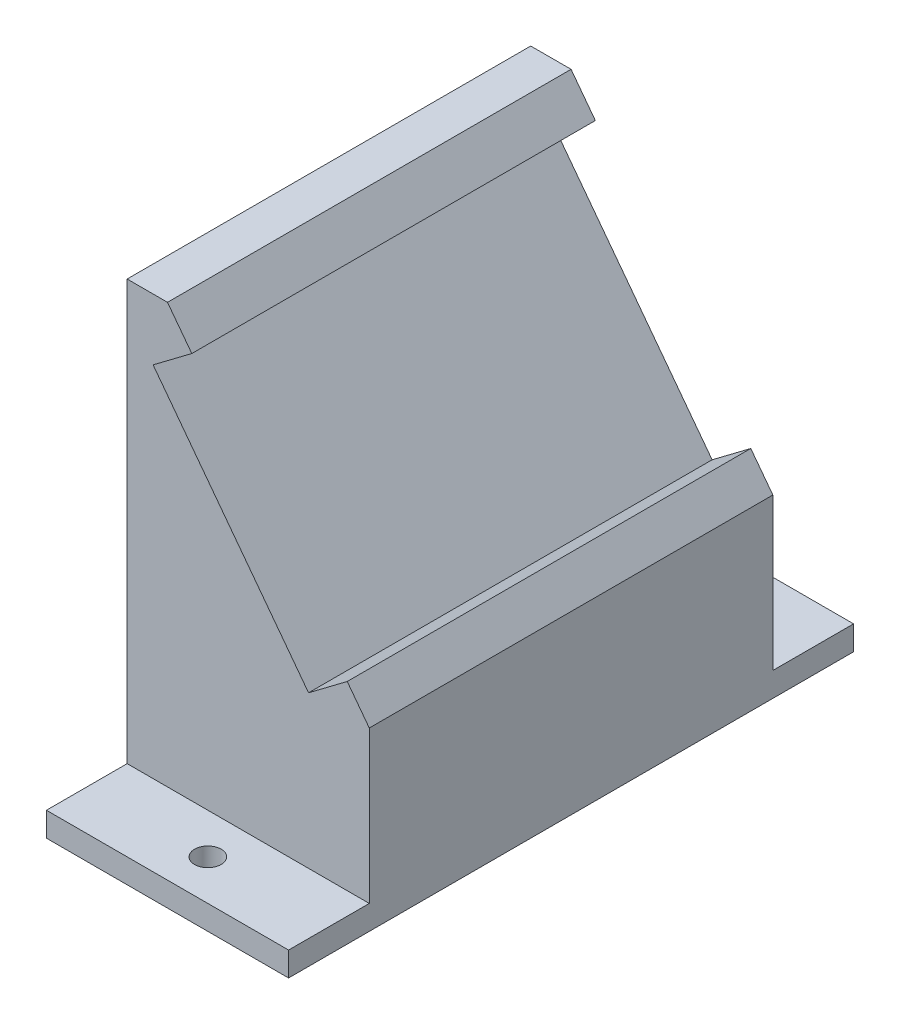
ISO-10303-21;
HEADER;
FILE_DESCRIPTION(('STEP AP214'),'2;1');
FILE_NAME('part.step','',(''),(''),'','','');
FILE_SCHEMA(('AUTOMOTIVE_DESIGN { 1 0 10303 214 1 1 1 1 }'));
ENDSEC;
DATA;
#1=APPLICATION_CONTEXT('core data for automotive mechanical design processes');
#2=APPLICATION_PROTOCOL_DEFINITION('international standard','automotive_design',2000,#1);
#3=PRODUCT_CONTEXT('',#1,'mechanical');
#4=PRODUCT('Part','Part','',(#3));
#5=PRODUCT_RELATED_PRODUCT_CATEGORY('part','',(#4));
#6=PRODUCT_DEFINITION_FORMATION('','',#4);
#7=PRODUCT_DEFINITION_CONTEXT('part definition',#1,'design');
#8=PRODUCT_DEFINITION('design','',#6,#7);
#9=PRODUCT_DEFINITION_SHAPE('','',#8);
#10=(LENGTH_UNIT() NAMED_UNIT(*) SI_UNIT(.MILLI.,.METRE.));
#11=(NAMED_UNIT(*) PLANE_ANGLE_UNIT() SI_UNIT($,.RADIAN.));
#12=(NAMED_UNIT(*) SI_UNIT($,.STERADIAN.) SOLID_ANGLE_UNIT());
#13=UNCERTAINTY_MEASURE_WITH_UNIT(LENGTH_MEASURE(1.E-05),#10,'distance_accuracy_value','');
#14=(GEOMETRIC_REPRESENTATION_CONTEXT(3) GLOBAL_UNCERTAINTY_ASSIGNED_CONTEXT((#13)) GLOBAL_UNIT_ASSIGNED_CONTEXT((#10,
#11,#12)) REPRESENTATION_CONTEXT('',''));
#15=CARTESIAN_POINT('',(0.,0.,0.));
#16=DIRECTION('',(0.,0.,1.));
#17=DIRECTION('',(1.,0.,0.));
#18=AXIS2_PLACEMENT_3D('',#15,#16,#17);
#19=CARTESIAN_POINT('',(-15.,0.,-25.));
#20=DIRECTION('',(0.,-1.,0.));
#21=DIRECTION('',(0.,0.,-1.));
#22=AXIS2_PLACEMENT_3D('',#19,#20,#21);
#23=PLANE('',#22);
#24=CARTESIAN_POINT('',(0.,0.,-30.));
#25=DIRECTION('',(0.,-1.,0.));
#26=DIRECTION('',(0.,0.,-1.));
#27=AXIS2_PLACEMENT_3D('',#24,#25,#26);
#28=CIRCLE('',#27,1.65);
#29=CARTESIAN_POINT('',(0.,0.,-31.65));
#30=VERTEX_POINT('',#29);
#31=EDGE_CURVE('E169',#30,#30,#28,.T.);
#32=ORIENTED_EDGE('',*,*,#31,.F.);
#33=EDGE_LOOP('',(#32));
#34=FACE_BOUND('',#33,.T.);
#35=CARTESIAN_POINT('',(0.,0.,30.));
#36=DIRECTION('',(0.,-1.,0.));
#37=DIRECTION('',(0.,0.,-1.));
#38=AXIS2_PLACEMENT_3D('',#35,#36,#37);
#39=CIRCLE('',#38,1.65);
#40=CARTESIAN_POINT('',(0.,0.,28.35));
#41=VERTEX_POINT('',#40);
#42=EDGE_CURVE('E175',#41,#41,#39,.F.);
#43=ORIENTED_EDGE('',*,*,#42,.T.);
#44=EDGE_LOOP('',(#43));
#45=FACE_BOUND('',#44,.T.);
#46=DIRECTION('',(0.,0.,1.));
#47=VECTOR('',#46,1.);
#48=CARTESIAN_POINT('',(15.,0.,-25.));
#49=LINE('',#48,#47);
#50=CARTESIAN_POINT('',(15.,0.,-35.));
#51=VERTEX_POINT('',#50);
#52=CARTESIAN_POINT('',(15.,0.,35.));
#53=VERTEX_POINT('',#52);
#54=EDGE_CURVE('E42',#51,#53,#49,.T.);
#55=ORIENTED_EDGE('',*,*,#54,.T.);
#56=DIRECTION('',(1.,0.,0.));
#57=VECTOR('',#56,1.);
#58=CARTESIAN_POINT('',(-15.,0.,35.));
#59=LINE('',#58,#57);
#60=CARTESIAN_POINT('',(-15.,0.,35.));
#61=VERTEX_POINT('',#60);
#62=EDGE_CURVE('E183',#61,#53,#59,.T.);
#63=ORIENTED_EDGE('',*,*,#62,.F.);
#64=DIRECTION('',(0.,0.,1.));
#65=VECTOR('',#64,1.);
#66=CARTESIAN_POINT('',(-15.,0.,-25.));
#67=LINE('',#66,#65);
#68=CARTESIAN_POINT('',(-15.,0.,-35.));
#69=VERTEX_POINT('',#68);
#70=EDGE_CURVE('E11',#69,#61,#67,.T.);
#71=ORIENTED_EDGE('',*,*,#70,.F.);
#72=DIRECTION('',(1.,0.,0.));
#73=VECTOR('',#72,1.);
#74=CARTESIAN_POINT('',(-15.,0.,-35.));
#75=LINE('',#74,#73);
#76=EDGE_CURVE('E153',#69,#51,#75,.T.);
#77=ORIENTED_EDGE('',*,*,#76,.T.);
#78=EDGE_LOOP('',(#55,#63,#71,#77));
#79=FACE_BOUND('',#78,.T.);
#80=ADVANCED_FACE('F39',(#34,#45,#79),#23,.T.);
#81=CARTESIAN_POINT('',(-15.,0.,-25.));
#82=DIRECTION('',(1.,0.,0.));
#83=DIRECTION('',(0.,0.,-1.));
#84=AXIS2_PLACEMENT_3D('',#81,#82,#83);
#85=PLANE('',#84);
#86=ORIENTED_EDGE('',*,*,#70,.T.);
#87=DIRECTION('',(0.,-1.,0.));
#88=VECTOR('',#87,1.);
#89=CARTESIAN_POINT('',(-15.,0.,35.));
#90=LINE('',#89,#88);
#91=CARTESIAN_POINT('',(-15.,3.,35.));
#92=VERTEX_POINT('',#91);
#93=EDGE_CURVE('E179',#92,#61,#90,.T.);
#94=ORIENTED_EDGE('',*,*,#93,.F.);
#95=DIRECTION('',(0.,0.,-1.));
#96=VECTOR('',#95,1.);
#97=CARTESIAN_POINT('',(-15.,3.,35.));
#98=LINE('',#97,#96);
#99=CARTESIAN_POINT('',(-15.,3.,25.));
#100=VERTEX_POINT('',#99);
#101=EDGE_CURVE('E193',#92,#100,#98,.T.);
#102=ORIENTED_EDGE('',*,*,#101,.T.);
#103=DIRECTION('',(0.,1.,0.));
#104=VECTOR('',#103,1.);
#105=CARTESIAN_POINT('',(-15.,0.,25.));
#106=LINE('',#105,#104);
#107=CARTESIAN_POINT('',(-15.,55.,25.));
#108=VERTEX_POINT('',#107);
#109=EDGE_CURVE('E230',#100,#108,#106,.T.);
#110=ORIENTED_EDGE('',*,*,#109,.T.);
#111=DIRECTION('',(0.,0.,1.));
#112=VECTOR('',#111,1.);
#113=CARTESIAN_POINT('',(-15.,55.,-25.));
#114=LINE('',#113,#112);
#115=CARTESIAN_POINT('',(-15.,55.,-25.));
#116=VERTEX_POINT('',#115);
#117=EDGE_CURVE('E48',#116,#108,#114,.T.);
#118=ORIENTED_EDGE('',*,*,#117,.F.);
#119=DIRECTION('',(0.,1.,0.));
#120=VECTOR('',#119,1.);
#121=CARTESIAN_POINT('',(-15.,0.,-25.));
#122=LINE('',#121,#120);
#123=CARTESIAN_POINT('',(-15.,3.,-25.));
#124=VERTEX_POINT('',#123);
#125=EDGE_CURVE('E141',#124,#116,#122,.T.);
#126=ORIENTED_EDGE('',*,*,#125,.F.);
#127=DIRECTION('',(0.,0.,1.));
#128=VECTOR('',#127,1.);
#129=CARTESIAN_POINT('',(-15.,3.,-35.));
#130=LINE('',#129,#128);
#131=CARTESIAN_POINT('',(-15.,3.,-35.));
#132=VERTEX_POINT('',#131);
#133=EDGE_CURVE('E56',#132,#124,#130,.T.);
#134=ORIENTED_EDGE('',*,*,#133,.F.);
#135=DIRECTION('',(0.,-1.,0.));
#136=VECTOR('',#135,1.);
#137=CARTESIAN_POINT('',(-15.,0.,-35.));
#138=LINE('',#137,#136);
#139=EDGE_CURVE('E138',#132,#69,#138,.T.);
#140=ORIENTED_EDGE('',*,*,#139,.T.);
#141=EDGE_LOOP('',(#86,#94,#102,#110,#118,#126,#134,#140));
#142=FACE_BOUND('',#141,.T.);
#143=ADVANCED_FACE('F137',(#142),#85,.F.);
#144=CARTESIAN_POINT('',(-10.,55.,-25.));
#145=DIRECTION('',(0.,1.,0.));
#146=DIRECTION('',(0.,0.,1.));
#147=AXIS2_PLACEMENT_3D('',#144,#145,#146);
#148=PLANE('',#147);
#149=ORIENTED_EDGE('',*,*,#117,.T.);
#150=DIRECTION('',(-1.,0.,0.));
#151=VECTOR('',#150,1.);
#152=CARTESIAN_POINT('',(-10.,55.,25.));
#153=LINE('',#152,#151);
#154=CARTESIAN_POINT('',(-10.,55.,25.));
#155=VERTEX_POINT('',#154);
#156=EDGE_CURVE('E226',#155,#108,#153,.T.);
#157=ORIENTED_EDGE('',*,*,#156,.F.);
#158=DIRECTION('',(0.,0.,1.));
#159=VECTOR('',#158,1.);
#160=CARTESIAN_POINT('',(-10.,55.,-25.));
#161=LINE('',#160,#159);
#162=CARTESIAN_POINT('',(-10.,55.,-25.));
#163=VERTEX_POINT('',#162);
#164=EDGE_CURVE('E261',#163,#155,#161,.T.);
#165=ORIENTED_EDGE('',*,*,#164,.F.);
#166=DIRECTION('',(-1.,0.,0.));
#167=VECTOR('',#166,1.);
#168=CARTESIAN_POINT('',(-10.,55.,-25.));
#169=LINE('',#168,#167);
#170=EDGE_CURVE('E252',#163,#116,#169,.T.);
#171=ORIENTED_EDGE('',*,*,#170,.T.);
#172=EDGE_LOOP('',(#149,#157,#165,#171));
#173=FACE_BOUND('',#172,.T.);
#174=ADVANCED_FACE('F295',(#173),#148,.T.);
#175=CARTESIAN_POINT('',(-10.,55.,-25.));
#176=DIRECTION('',(-0.798635510047289,-0.601815023152053,0.));
#177=DIRECTION('',(0.601815023152053,-0.798635510047289,0.));
#178=AXIS2_PLACEMENT_3D('',#175,#176,#177);
#179=PLANE('',#178);
#180=ORIENTED_EDGE('',*,*,#164,.T.);
#181=DIRECTION('',(0.601815023152053,-0.798635510047289,0.));
#182=VECTOR('',#181,1.);
#183=CARTESIAN_POINT('',(-10.,55.,25.));
#184=LINE('',#183,#182);
#185=CARTESIAN_POINT('',(-6.99092488423973,51.0068224497636,25.));
#186=VERTEX_POINT('',#185);
#187=EDGE_CURVE('E222',#155,#186,#184,.T.);
#188=ORIENTED_EDGE('',*,*,#187,.T.);
#189=DIRECTION('',(0.,0.,1.));
#190=VECTOR('',#189,1.);
#191=CARTESIAN_POINT('',(-6.99092488423973,51.0068224497636,-25.));
#192=LINE('',#191,#190);
#193=CARTESIAN_POINT('',(-6.99092488423973,51.0068224497636,-25.));
#194=VERTEX_POINT('',#193);
#195=EDGE_CURVE('E264',#194,#186,#192,.T.);
#196=ORIENTED_EDGE('',*,*,#195,.F.);
#197=DIRECTION('',(0.601815023152053,-0.798635510047289,0.));
#198=VECTOR('',#197,1.);
#199=CARTESIAN_POINT('',(-10.,55.,-25.));
#200=LINE('',#199,#198);
#201=EDGE_CURVE('E249',#163,#194,#200,.T.);
#202=ORIENTED_EDGE('',*,*,#201,.F.);
#203=EDGE_LOOP('',(#180,#188,#196,#202));
#204=FACE_BOUND('',#203,.T.);
#205=ADVANCED_FACE('F303',(#204),#179,.F.);
#206=CARTESIAN_POINT('',(-6.99092488423973,51.0068224497636,-25.));
#207=DIRECTION('',(-0.601815023152052,0.79863551004729,0.));
#208=DIRECTION('',(-0.79863551004729,-0.601815023152052,0.));
#209=AXIS2_PLACEMENT_3D('',#206,#207,#208);
#210=PLANE('',#209);
#211=ORIENTED_EDGE('',*,*,#195,.T.);
#212=DIRECTION('',(-0.79863551004729,-0.601815023152052,0.));
#213=VECTOR('',#212,1.);
#214=CARTESIAN_POINT('',(-6.99092488423973,51.0068224497636,25.));
#215=LINE('',#214,#213);
#216=CARTESIAN_POINT('',(-11.7827379445235,47.3959323108512,25.));
#217=VERTEX_POINT('',#216);
#218=EDGE_CURVE('E218',#186,#217,#215,.T.);
#219=ORIENTED_EDGE('',*,*,#218,.T.);
#220=DIRECTION('',(0.,0.,1.));
#221=VECTOR('',#220,1.);
#222=CARTESIAN_POINT('',(-11.7827379445235,47.3959323108512,-25.));
#223=LINE('',#222,#221);
#224=CARTESIAN_POINT('',(-11.7827379445235,47.3959323108512,-25.));
#225=VERTEX_POINT('',#224);
#226=EDGE_CURVE('E267',#225,#217,#223,.T.);
#227=ORIENTED_EDGE('',*,*,#226,.F.);
#228=DIRECTION('',(-0.79863551004729,-0.601815023152052,0.));
#229=VECTOR('',#228,1.);
#230=CARTESIAN_POINT('',(-6.99092488423973,51.0068224497636,-25.));
#231=LINE('',#230,#229);
#232=EDGE_CURVE('E246',#194,#225,#231,.T.);
#233=ORIENTED_EDGE('',*,*,#232,.F.);
#234=EDGE_LOOP('',(#211,#219,#227,#233));
#235=FACE_BOUND('',#234,.T.);
#236=ADVANCED_FACE('F324',(#235),#210,.F.);
#237=CARTESIAN_POINT('',(-11.7827379445235,47.3959323108512,-25.));
#238=DIRECTION('',(-0.798635510047289,-0.601815023152053,0.));
#239=DIRECTION('',(0.601815023152053,-0.798635510047289,0.));
#240=AXIS2_PLACEMENT_3D('',#237,#238,#239);
#241=PLANE('',#240);
#242=ORIENTED_EDGE('',*,*,#226,.T.);
#243=DIRECTION('',(0.601815023152053,-0.798635510047289,0.));
#244=VECTOR('',#243,1.);
#245=CARTESIAN_POINT('',(-11.7827379445235,47.3959323108512,25.));
#246=LINE('',#245,#244);
#247=CARTESIAN_POINT('',(7.47534279634223,21.839595989338,25.));
#248=VERTEX_POINT('',#247);
#249=EDGE_CURVE('E214',#217,#248,#246,.T.);
#250=ORIENTED_EDGE('',*,*,#249,.T.);
#251=DIRECTION('',(0.,0.,1.));
#252=VECTOR('',#251,1.);
#253=CARTESIAN_POINT('',(7.47534279634223,21.839595989338,-25.));
#254=LINE('',#253,#252);
#255=CARTESIAN_POINT('',(7.47534279634223,21.839595989338,-25.));
#256=VERTEX_POINT('',#255);
#257=EDGE_CURVE('E270',#256,#248,#254,.T.);
#258=ORIENTED_EDGE('',*,*,#257,.F.);
#259=DIRECTION('',(0.601815023152053,-0.798635510047289,0.));
#260=VECTOR('',#259,1.);
#261=CARTESIAN_POINT('',(-11.7827379445235,47.3959323108512,-25.));
#262=LINE('',#261,#260);
#263=EDGE_CURVE('E243',#225,#256,#262,.T.);
#264=ORIENTED_EDGE('',*,*,#263,.F.);
#265=EDGE_LOOP('',(#242,#250,#258,#264));
#266=FACE_BOUND('',#265,.T.);
#267=ADVANCED_FACE('F321',(#266),#241,.F.);
#268=CARTESIAN_POINT('',(7.47534279634223,21.839595989338,-25.));
#269=DIRECTION('',(0.601815023152062,-0.798635510047283,0.));
#270=DIRECTION('',(0.798635510047283,0.601815023152062,0.));
#271=AXIS2_PLACEMENT_3D('',#268,#269,#270);
#272=PLANE('',#271);
#273=ORIENTED_EDGE('',*,*,#257,.T.);
#274=DIRECTION('',(0.798635510047282,0.601815023152062,0.));
#275=VECTOR('',#274,1.);
#276=CARTESIAN_POINT('',(7.47534279634223,21.839595989338,25.));
#277=LINE('',#276,#275);
#278=CARTESIAN_POINT('',(12.2671558566259,25.4504861282503,25.));
#279=VERTEX_POINT('',#278);
#280=EDGE_CURVE('E210',#248,#279,#277,.T.);
#281=ORIENTED_EDGE('',*,*,#280,.T.);
#282=DIRECTION('',(0.,0.,1.));
#283=VECTOR('',#282,1.);
#284=CARTESIAN_POINT('',(12.2671558566259,25.4504861282503,-25.));
#285=LINE('',#284,#283);
#286=CARTESIAN_POINT('',(12.2671558566259,25.4504861282503,-25.));
#287=VERTEX_POINT('',#286);
#288=EDGE_CURVE('E273',#287,#279,#285,.T.);
#289=ORIENTED_EDGE('',*,*,#288,.F.);
#290=DIRECTION('',(0.798635510047282,0.601815023152062,0.));
#291=VECTOR('',#290,1.);
#292=CARTESIAN_POINT('',(7.47534279634223,21.839595989338,-25.));
#293=LINE('',#292,#291);
#294=EDGE_CURVE('E240',#256,#287,#293,.T.);
#295=ORIENTED_EDGE('',*,*,#294,.F.);
#296=EDGE_LOOP('',(#273,#281,#289,#295));
#297=FACE_BOUND('',#296,.T.);
#298=ADVANCED_FACE('F317',(#297),#272,.F.);
#299=CARTESIAN_POINT('',(12.2671558566259,25.4504861282503,-25.));
#300=DIRECTION('',(-0.798635510047289,-0.601815023152054,0.));
#301=DIRECTION('',(0.601815023152054,-0.798635510047289,0.));
#302=AXIS2_PLACEMENT_3D('',#299,#300,#301);
#303=PLANE('',#302);
#304=ORIENTED_EDGE('',*,*,#288,.T.);
#305=DIRECTION('',(0.601815023152054,-0.798635510047289,0.));
#306=VECTOR('',#305,1.);
#307=CARTESIAN_POINT('',(12.2671558566259,25.4504861282503,25.));
#308=LINE('',#307,#306);
#309=CARTESIAN_POINT('',(15.,21.8238794594901,25.));
#310=VERTEX_POINT('',#309);
#311=EDGE_CURVE('E206',#279,#310,#308,.T.);
#312=ORIENTED_EDGE('',*,*,#311,.T.);
#313=DIRECTION('',(0.,0.,1.));
#314=VECTOR('',#313,1.);
#315=CARTESIAN_POINT('',(15.,21.8238794594901,-25.));
#316=LINE('',#315,#314);
#317=CARTESIAN_POINT('',(15.,21.8238794594901,-25.));
#318=VERTEX_POINT('',#317);
#319=EDGE_CURVE('E275',#318,#310,#316,.T.);
#320=ORIENTED_EDGE('',*,*,#319,.F.);
#321=DIRECTION('',(0.601815023152054,-0.798635510047289,0.));
#322=VECTOR('',#321,1.);
#323=CARTESIAN_POINT('',(12.2671558566259,25.4504861282503,-25.));
#324=LINE('',#323,#322);
#325=EDGE_CURVE('E236',#287,#318,#324,.T.);
#326=ORIENTED_EDGE('',*,*,#325,.F.);
#327=EDGE_LOOP('',(#304,#312,#320,#326));
#328=FACE_BOUND('',#327,.T.);
#329=ADVANCED_FACE('F313',(#328),#303,.F.);
#330=CARTESIAN_POINT('',(15.,0.,-25.));
#331=DIRECTION('',(1.,0.,0.));
#332=DIRECTION('',(0.,0.,-1.));
#333=AXIS2_PLACEMENT_3D('',#330,#331,#332);
#334=PLANE('',#333);
#335=ORIENTED_EDGE('',*,*,#319,.T.);
#336=DIRECTION('',(0.,1.,0.));
#337=VECTOR('',#336,1.);
#338=CARTESIAN_POINT('',(15.,0.,25.));
#339=LINE('',#338,#337);
#340=CARTESIAN_POINT('',(15.,3.,25.));
#341=VERTEX_POINT('',#340);
#342=EDGE_CURVE('E203',#341,#310,#339,.T.);
#343=ORIENTED_EDGE('',*,*,#342,.F.);
#344=DIRECTION('',(0.,0.,-1.));
#345=VECTOR('',#344,1.);
#346=CARTESIAN_POINT('',(15.,3.,35.));
#347=LINE('',#346,#345);
#348=CARTESIAN_POINT('',(15.,3.,35.));
#349=VERTEX_POINT('',#348);
#350=EDGE_CURVE('E199',#349,#341,#347,.T.);
#351=ORIENTED_EDGE('',*,*,#350,.F.);
#352=DIRECTION('',(0.,1.,0.));
#353=VECTOR('',#352,1.);
#354=CARTESIAN_POINT('',(15.,0.,35.));
#355=LINE('',#354,#353);
#356=EDGE_CURVE('E187',#53,#349,#355,.T.);
#357=ORIENTED_EDGE('',*,*,#356,.F.);
#358=ORIENTED_EDGE('',*,*,#54,.F.);
#359=DIRECTION('',(0.,1.,0.));
#360=VECTOR('',#359,1.);
#361=CARTESIAN_POINT('',(15.,0.,-35.));
#362=LINE('',#361,#360);
#363=CARTESIAN_POINT('',(15.,3.,-35.));
#364=VERTEX_POINT('',#363);
#365=EDGE_CURVE('E159',#51,#364,#362,.T.);
#366=ORIENTED_EDGE('',*,*,#365,.T.);
#367=DIRECTION('',(0.,0.,1.));
#368=VECTOR('',#367,1.);
#369=CARTESIAN_POINT('',(15.,3.,-35.));
#370=LINE('',#369,#368);
#371=CARTESIAN_POINT('',(15.,3.,-25.));
#372=VERTEX_POINT('',#371);
#373=EDGE_CURVE('E144',#364,#372,#370,.T.);
#374=ORIENTED_EDGE('',*,*,#373,.T.);
#375=DIRECTION('',(0.,1.,0.));
#376=VECTOR('',#375,1.);
#377=CARTESIAN_POINT('',(15.,0.,-25.));
#378=LINE('',#377,#376);
#379=EDGE_CURVE('E233',#372,#318,#378,.T.);
#380=ORIENTED_EDGE('',*,*,#379,.T.);
#381=EDGE_LOOP('',(#335,#343,#351,#357,#358,#366,#374,#380));
#382=FACE_BOUND('',#381,.T.);
#383=ADVANCED_FACE('F288',(#382),#334,.T.);
#384=CARTESIAN_POINT('',(0.,0.,-25.));
#385=DIRECTION('',(0.,0.,1.));
#386=DIRECTION('',(1.,0.,0.));
#387=AXIS2_PLACEMENT_3D('',#384,#385,#386);
#388=PLANE('',#387);
#389=ORIENTED_EDGE('',*,*,#379,.F.);
#390=DIRECTION('',(-1.,0.,0.));
#391=VECTOR('',#390,1.);
#392=CARTESIAN_POINT('',(-15.,3.,-25.));
#393=LINE('',#392,#391);
#394=EDGE_CURVE('E155',#372,#124,#393,.T.);
#395=ORIENTED_EDGE('',*,*,#394,.T.);
#396=ORIENTED_EDGE('',*,*,#125,.T.);
#397=ORIENTED_EDGE('',*,*,#170,.F.);
#398=ORIENTED_EDGE('',*,*,#201,.T.);
#399=ORIENTED_EDGE('',*,*,#232,.T.);
#400=ORIENTED_EDGE('',*,*,#263,.T.);
#401=ORIENTED_EDGE('',*,*,#294,.T.);
#402=ORIENTED_EDGE('',*,*,#325,.T.);
#403=EDGE_LOOP('',(#389,#395,#396,#397,#398,#399,#400,#401,#402));
#404=FACE_BOUND('',#403,.T.);
#405=ADVANCED_FACE('F308',(#404),#388,.F.);
#406=CARTESIAN_POINT('',(0.,0.,25.));
#407=DIRECTION('',(0.,0.,1.));
#408=DIRECTION('',(1.,0.,0.));
#409=AXIS2_PLACEMENT_3D('',#406,#407,#408);
#410=PLANE('',#409);
#411=DIRECTION('',(-1.,0.,0.));
#412=VECTOR('',#411,1.);
#413=CARTESIAN_POINT('',(-15.,3.,25.));
#414=LINE('',#413,#412);
#415=EDGE_CURVE('E64',#341,#100,#414,.T.);
#416=ORIENTED_EDGE('',*,*,#415,.F.);
#417=ORIENTED_EDGE('',*,*,#342,.T.);
#418=ORIENTED_EDGE('',*,*,#311,.F.);
#419=ORIENTED_EDGE('',*,*,#280,.F.);
#420=ORIENTED_EDGE('',*,*,#249,.F.);
#421=ORIENTED_EDGE('',*,*,#218,.F.);
#422=ORIENTED_EDGE('',*,*,#187,.F.);
#423=ORIENTED_EDGE('',*,*,#156,.T.);
#424=ORIENTED_EDGE('',*,*,#109,.F.);
#425=EDGE_LOOP('',(#416,#417,#418,#419,#420,#421,#422,#423,#424));
#426=FACE_BOUND('',#425,.T.);
#427=ADVANCED_FACE('F298',(#426),#410,.T.);
#428=CARTESIAN_POINT('',(-15.,3.,35.));
#429=DIRECTION('',(0.,-1.,0.));
#430=DIRECTION('',(0.,0.,-1.));
#431=AXIS2_PLACEMENT_3D('',#428,#429,#430);
#432=PLANE('',#431);
#433=CARTESIAN_POINT('',(0.,3.,30.));
#434=DIRECTION('',(0.,1.,0.));
#435=DIRECTION('',(0.,0.,1.));
#436=AXIS2_PLACEMENT_3D('',#433,#434,#435);
#437=CIRCLE('',#436,1.65);
#438=CARTESIAN_POINT('',(0.,3.,31.65));
#439=VERTEX_POINT('',#438);
#440=EDGE_CURVE('E143',#439,#439,#437,.T.);
#441=ORIENTED_EDGE('',*,*,#440,.F.);
#442=EDGE_LOOP('',(#441));
#443=FACE_BOUND('',#442,.T.);
#444=ORIENTED_EDGE('',*,*,#415,.T.);
#445=ORIENTED_EDGE('',*,*,#101,.F.);
#446=DIRECTION('',(-1.,0.,0.));
#447=VECTOR('',#446,1.);
#448=CARTESIAN_POINT('',(-15.,3.,35.));
#449=LINE('',#448,#447);
#450=EDGE_CURVE('E190',#349,#92,#449,.T.);
#451=ORIENTED_EDGE('',*,*,#450,.F.);
#452=ORIENTED_EDGE('',*,*,#350,.T.);
#453=EDGE_LOOP('',(#444,#445,#451,#452));
#454=FACE_BOUND('',#453,.T.);
#455=ADVANCED_FACE('F292',(#443,#454),#432,.F.);
#456=CARTESIAN_POINT('',(0.,0.,35.));
#457=DIRECTION('',(0.,0.,-1.));
#458=DIRECTION('',(-1.,0.,0.));
#459=AXIS2_PLACEMENT_3D('',#456,#457,#458);
#460=PLANE('',#459);
#461=ORIENTED_EDGE('',*,*,#93,.T.);
#462=ORIENTED_EDGE('',*,*,#62,.T.);
#463=ORIENTED_EDGE('',*,*,#356,.T.);
#464=ORIENTED_EDGE('',*,*,#450,.T.);
#465=EDGE_LOOP('',(#461,#462,#463,#464));
#466=FACE_BOUND('',#465,.T.);
#467=ADVANCED_FACE('F285',(#466),#460,.F.);
#468=CARTESIAN_POINT('',(0.,-4.66690475583121,30.));
#469=DIRECTION('',(0.,1.,0.));
#470=DIRECTION('',(0.,0.,1.));
#471=AXIS2_PLACEMENT_3D('',#468,#469,#470);
#472=CYLINDRICAL_SURFACE('',#471,1.65);
#473=ORIENTED_EDGE('',*,*,#440,.T.);
#474=EDGE_LOOP('',(#473));
#475=FACE_BOUND('',#474,.T.);
#476=ORIENTED_EDGE('',*,*,#42,.F.);
#477=EDGE_LOOP('',(#476));
#478=FACE_BOUND('',#477,.T.);
#479=ADVANCED_FACE('F344',(#475,#478),#472,.F.);
#480=CARTESIAN_POINT('',(-15.,3.,-35.));
#481=DIRECTION('',(0.,1.,0.));
#482=DIRECTION('',(0.,0.,1.));
#483=AXIS2_PLACEMENT_3D('',#480,#481,#482);
#484=PLANE('',#483);
#485=CARTESIAN_POINT('',(0.,3.,-30.));
#486=DIRECTION('',(0.,-1.,0.));
#487=DIRECTION('',(0.,0.,-1.));
#488=AXIS2_PLACEMENT_3D('',#485,#486,#487);
#489=CIRCLE('',#488,1.65);
#490=CARTESIAN_POINT('',(0.,3.,-31.65));
#491=VERTEX_POINT('',#490);
#492=EDGE_CURVE('E476',#491,#491,#489,.T.);
#493=ORIENTED_EDGE('',*,*,#492,.T.);
#494=EDGE_LOOP('',(#493));
#495=FACE_BOUND('',#494,.T.);
#496=ORIENTED_EDGE('',*,*,#394,.F.);
#497=ORIENTED_EDGE('',*,*,#373,.F.);
#498=DIRECTION('',(-1.,0.,0.));
#499=VECTOR('',#498,1.);
#500=CARTESIAN_POINT('',(-15.,3.,-35.));
#501=LINE('',#500,#499);
#502=EDGE_CURVE('E150',#364,#132,#501,.T.);
#503=ORIENTED_EDGE('',*,*,#502,.T.);
#504=ORIENTED_EDGE('',*,*,#133,.T.);
#505=EDGE_LOOP('',(#496,#497,#503,#504));
#506=FACE_BOUND('',#505,.T.);
#507=ADVANCED_FACE('F157',(#495,#506),#484,.T.);
#508=CARTESIAN_POINT('',(0.,0.,-35.));
#509=DIRECTION('',(0.,0.,1.));
#510=DIRECTION('',(-1.,0.,0.));
#511=AXIS2_PLACEMENT_3D('',#508,#509,#510);
#512=PLANE('',#511);
#513=ORIENTED_EDGE('',*,*,#139,.F.);
#514=ORIENTED_EDGE('',*,*,#502,.F.);
#515=ORIENTED_EDGE('',*,*,#365,.F.);
#516=ORIENTED_EDGE('',*,*,#76,.F.);
#517=EDGE_LOOP('',(#513,#514,#515,#516));
#518=FACE_BOUND('',#517,.T.);
#519=ADVANCED_FACE('F148',(#518),#512,.F.);
#520=CARTESIAN_POINT('',(0.,-4.66690475583121,-30.));
#521=DIRECTION('',(0.,1.,0.));
#522=DIRECTION('',(0.,0.,1.));
#523=AXIS2_PLACEMENT_3D('',#520,#521,#522);
#524=CYLINDRICAL_SURFACE('',#523,1.65);
#525=ORIENTED_EDGE('',*,*,#492,.F.);
#526=EDGE_LOOP('',(#525));
#527=FACE_BOUND('',#526,.T.);
#528=ORIENTED_EDGE('',*,*,#31,.T.);
#529=EDGE_LOOP('',(#528));
#530=FACE_BOUND('',#529,.T.);
#531=ADVANCED_FACE('F461',(#527,#530),#524,.F.);
#532=CLOSED_SHELL('',(#80,#143,#174,#205,#236,#267,#298,#329,#383,#405,#427,#455,#467,#479,#507,
#519,#531));
#533=MANIFOLD_SOLID_BREP('B2',#532);
#534=ADVANCED_BREP_SHAPE_REPRESENTATION('',(#18,#533),#14);
#535=SHAPE_DEFINITION_REPRESENTATION(#9,#534);
ENDSEC;
END-ISO-10303-21;
